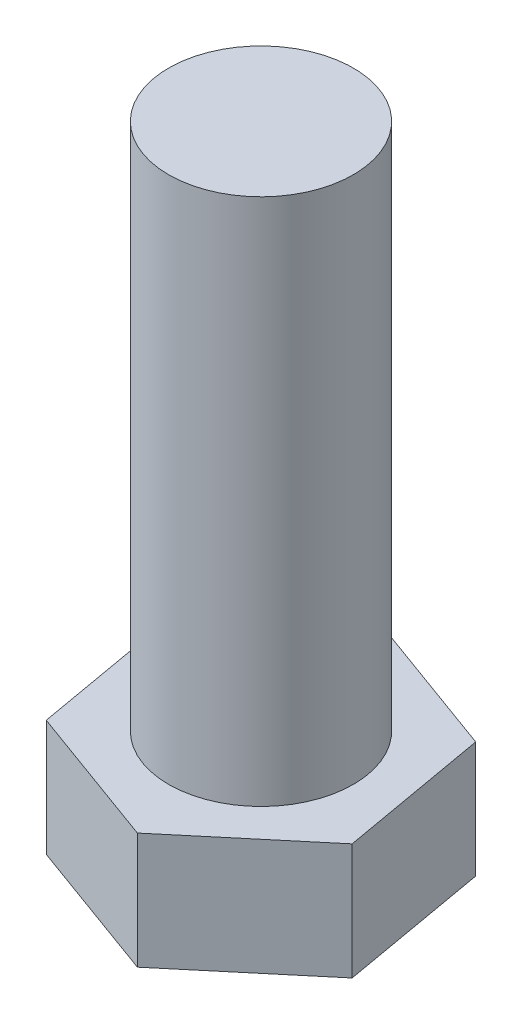
ISO-10303-21;
HEADER;
FILE_DESCRIPTION(('STEP AP214'),'2;1');
FILE_NAME('part.step','',(''),(''),'','','');
FILE_SCHEMA(('AUTOMOTIVE_DESIGN { 1 0 10303 214 1 1 1 1 }'));
ENDSEC;
DATA;
#1=APPLICATION_CONTEXT('core data for automotive mechanical design processes');
#2=APPLICATION_PROTOCOL_DEFINITION('international standard','automotive_design',2000,#1);
#3=PRODUCT_CONTEXT('',#1,'mechanical');
#4=PRODUCT('Part','Part','',(#3));
#5=PRODUCT_RELATED_PRODUCT_CATEGORY('part','',(#4));
#6=PRODUCT_DEFINITION_FORMATION('','',#4);
#7=PRODUCT_DEFINITION_CONTEXT('part definition',#1,'design');
#8=PRODUCT_DEFINITION('design','',#6,#7);
#9=PRODUCT_DEFINITION_SHAPE('','',#8);
#10=(LENGTH_UNIT() NAMED_UNIT(*) SI_UNIT(.MILLI.,.METRE.));
#11=(NAMED_UNIT(*) PLANE_ANGLE_UNIT() SI_UNIT($,.RADIAN.));
#12=(NAMED_UNIT(*) SI_UNIT($,.STERADIAN.) SOLID_ANGLE_UNIT());
#13=UNCERTAINTY_MEASURE_WITH_UNIT(LENGTH_MEASURE(1.E-05),#10,'distance_accuracy_value','');
#14=(GEOMETRIC_REPRESENTATION_CONTEXT(3) GLOBAL_UNCERTAINTY_ASSIGNED_CONTEXT((#13)) GLOBAL_UNIT_ASSIGNED_CONTEXT((#10,
#11,#12)) REPRESENTATION_CONTEXT('',''));
#15=CARTESIAN_POINT('',(0.,0.,0.));
#16=DIRECTION('',(0.,0.,1.));
#17=DIRECTION('',(1.,0.,0.));
#18=AXIS2_PLACEMENT_3D('',#15,#16,#17);
#19=CARTESIAN_POINT('',(2.00670018627211,8.8,11.3713010555411));
#20=DIRECTION('',(0.,1.,0.));
#21=DIRECTION('',(0.,0.,1.));
#22=AXIS2_PLACEMENT_3D('',#19,#20,#21);
#23=PLANE('',#22);
#24=DIRECTION('',(0.939740246120108,0.,0.34188926543856));
#25=VECTOR('',#24,1.);
#26=CARTESIAN_POINT('',(-8.84448549504337,8.8,7.42350386686119));
#27=LINE('',#26,#25);
#28=CARTESIAN_POINT('',(-8.84448549504337,8.8,7.42350386686119));
#29=VERTEX_POINT('',#28);
#30=CARTESIAN_POINT('',(2.00670018627211,8.8,11.3713010555411));
#31=VERTEX_POINT('',#30);
#32=EDGE_CURVE('E128',#29,#31,#27,.T.);
#33=ORIENTED_EDGE('',*,*,#32,.T.);
#34=DIRECTION('',(0.765954912211048,0.,-0.642894293379375));
#35=VECTOR('',#34,1.);
#36=CARTESIAN_POINT('',(2.00670018627211,8.8,11.3713010555411));
#37=LINE('',#36,#35);
#38=CARTESIAN_POINT('',(10.8511856813155,8.8,3.94779718867995));
#39=VERTEX_POINT('',#38);
#40=EDGE_CURVE('E86',#31,#39,#37,.T.);
#41=ORIENTED_EDGE('',*,*,#40,.T.);
#42=DIRECTION('',(-0.17378533390906,0.,-0.984783558817934));
#43=VECTOR('',#42,1.);
#44=CARTESIAN_POINT('',(10.8511856813155,8.8,3.94779718867995));
#45=LINE('',#44,#43);
#46=CARTESIAN_POINT('',(8.84448549504337,8.8,-7.42350386686119));
#47=VERTEX_POINT('',#46);
#48=EDGE_CURVE('E99',#39,#47,#45,.T.);
#49=ORIENTED_EDGE('',*,*,#48,.T.);
#50=DIRECTION('',(-0.939740246120109,0.,-0.34188926543856));
#51=VECTOR('',#50,1.);
#52=CARTESIAN_POINT('',(8.84448549504337,8.8,-7.42350386686119));
#53=LINE('',#52,#51);
#54=CARTESIAN_POINT('',(-2.00670018627212,8.8,-11.3713010555411));
#55=VERTEX_POINT('',#54);
#56=EDGE_CURVE('E93',#47,#55,#53,.T.);
#57=ORIENTED_EDGE('',*,*,#56,.T.);
#58=DIRECTION('',(-0.765954912211048,0.,0.642894293379375));
#59=VECTOR('',#58,1.);
#60=CARTESIAN_POINT('',(-2.00670018627212,8.8,-11.3713010555411));
#61=LINE('',#60,#59);
#62=CARTESIAN_POINT('',(-10.8511856813155,8.8,-3.94779718867995));
#63=VERTEX_POINT('',#62);
#64=EDGE_CURVE('E97',#55,#63,#61,.T.);
#65=ORIENTED_EDGE('',*,*,#64,.T.);
#66=DIRECTION('',(0.17378533390906,0.,0.984783558817934));
#67=VECTOR('',#66,1.);
#68=CARTESIAN_POINT('',(-10.8511856813155,8.8,-3.94779718867995));
#69=LINE('',#68,#67);
#70=EDGE_CURVE('E49',#63,#29,#69,.T.);
#71=ORIENTED_EDGE('',*,*,#70,.T.);
#72=EDGE_LOOP('',(#33,#41,#49,#57,#65,#71));
#73=FACE_BOUND('',#72,.T.);
#74=CARTESIAN_POINT('',(0.,8.8,0.));
#75=DIRECTION('',(0.,1.,0.));
#76=DIRECTION('',(0.,0.,1.));
#77=AXIS2_PLACEMENT_3D('',#74,#75,#76);
#78=CIRCLE('',#77,7.);
#79=CARTESIAN_POINT('',(0.,8.8,7.));
#80=VERTEX_POINT('',#79);
#81=EDGE_CURVE('E168',#80,#80,#78,.T.);
#82=ORIENTED_EDGE('',*,*,#81,.F.);
#83=EDGE_LOOP('',(#82));
#84=FACE_BOUND('',#83,.T.);
#85=ADVANCED_FACE('F32',(#73,#84),#23,.T.);
#86=CARTESIAN_POINT('',(-8.84448549504337,8.8,7.42350386686119));
#87=DIRECTION('',(0.34188926543856,0.,-0.939740246120108));
#88=DIRECTION('',(-0.939740246120109,0.,-0.34188926543856));
#89=AXIS2_PLACEMENT_3D('',#86,#87,#88);
#90=PLANE('',#89);
#91=DIRECTION('',(0.939740246120108,0.,0.34188926543856));
#92=VECTOR('',#91,1.);
#93=CARTESIAN_POINT('',(-8.84448549504337,0.,7.42350386686119));
#94=LINE('',#93,#92);
#95=CARTESIAN_POINT('',(-8.84448549504337,0.,7.42350386686119));
#96=VERTEX_POINT('',#95);
#97=CARTESIAN_POINT('',(2.00670018627211,0.,11.3713010555411));
#98=VERTEX_POINT('',#97);
#99=EDGE_CURVE('E117',#96,#98,#94,.T.);
#100=ORIENTED_EDGE('',*,*,#99,.T.);
#101=DIRECTION('',(0.,-1.,0.));
#102=VECTOR('',#101,1.);
#103=CARTESIAN_POINT('',(2.00670018627211,8.8,11.3713010555411));
#104=LINE('',#103,#102);
#105=EDGE_CURVE('E11',#31,#98,#104,.T.);
#106=ORIENTED_EDGE('',*,*,#105,.F.);
#107=ORIENTED_EDGE('',*,*,#32,.F.);
#108=DIRECTION('',(0.,-1.,0.));
#109=VECTOR('',#108,1.);
#110=CARTESIAN_POINT('',(-8.84448549504337,8.8,7.42350386686119));
#111=LINE('',#110,#109);
#112=EDGE_CURVE('E113',#29,#96,#111,.T.);
#113=ORIENTED_EDGE('',*,*,#112,.T.);
#114=EDGE_LOOP('',(#100,#106,#107,#113));
#115=FACE_BOUND('',#114,.T.);
#116=ADVANCED_FACE('F34',(#115),#90,.F.);
#117=CARTESIAN_POINT('',(2.00670018627211,8.8,11.3713010555411));
#118=DIRECTION('',(-0.642894293379375,0.,-0.765954912211048));
#119=DIRECTION('',(-0.765954912211048,0.,0.642894293379375));
#120=AXIS2_PLACEMENT_3D('',#117,#118,#119);
#121=PLANE('',#120);
#122=DIRECTION('',(0.765954912211048,0.,-0.642894293379375));
#123=VECTOR('',#122,1.);
#124=CARTESIAN_POINT('',(2.00670018627211,0.,11.3713010555411));
#125=LINE('',#124,#123);
#126=CARTESIAN_POINT('',(10.8511856813155,0.,3.94779718867995));
#127=VERTEX_POINT('',#126);
#128=EDGE_CURVE('E120',#98,#127,#125,.T.);
#129=ORIENTED_EDGE('',*,*,#128,.T.);
#130=DIRECTION('',(0.,-1.,0.));
#131=VECTOR('',#130,1.);
#132=CARTESIAN_POINT('',(10.8511856813155,8.8,3.94779718867995));
#133=LINE('',#132,#131);
#134=EDGE_CURVE('E41',#39,#127,#133,.T.);
#135=ORIENTED_EDGE('',*,*,#134,.F.);
#136=ORIENTED_EDGE('',*,*,#40,.F.);
#137=ORIENTED_EDGE('',*,*,#105,.T.);
#138=EDGE_LOOP('',(#129,#135,#136,#137));
#139=FACE_BOUND('',#138,.T.);
#140=ADVANCED_FACE('F156',(#139),#121,.F.);
#141=CARTESIAN_POINT('',(10.8511856813155,8.8,3.94779718867995));
#142=DIRECTION('',(-0.984783558817935,0.,0.17378533390906));
#143=DIRECTION('',(0.17378533390906,0.,0.984783558817935));
#144=AXIS2_PLACEMENT_3D('',#141,#142,#143);
#145=PLANE('',#144);
#146=DIRECTION('',(-0.17378533390906,0.,-0.984783558817934));
#147=VECTOR('',#146,1.);
#148=CARTESIAN_POINT('',(10.8511856813155,0.,3.94779718867995));
#149=LINE('',#148,#147);
#150=CARTESIAN_POINT('',(8.84448549504337,0.,-7.42350386686119));
#151=VERTEX_POINT('',#150);
#152=EDGE_CURVE('E123',#127,#151,#149,.T.);
#153=ORIENTED_EDGE('',*,*,#152,.T.);
#154=DIRECTION('',(0.,-1.,0.));
#155=VECTOR('',#154,1.);
#156=CARTESIAN_POINT('',(8.84448549504337,8.8,-7.42350386686119));
#157=LINE('',#156,#155);
#158=EDGE_CURVE('E108',#47,#151,#157,.T.);
#159=ORIENTED_EDGE('',*,*,#158,.F.);
#160=ORIENTED_EDGE('',*,*,#48,.F.);
#161=ORIENTED_EDGE('',*,*,#134,.T.);
#162=EDGE_LOOP('',(#153,#159,#160,#161));
#163=FACE_BOUND('',#162,.T.);
#164=ADVANCED_FACE('F134',(#163),#145,.F.);
#165=CARTESIAN_POINT('',(8.84448549504337,8.8,-7.42350386686119));
#166=DIRECTION('',(-0.34188926543856,0.,0.939740246120109));
#167=DIRECTION('',(0.939740246120109,0.,0.34188926543856));
#168=AXIS2_PLACEMENT_3D('',#165,#166,#167);
#169=PLANE('',#168);
#170=DIRECTION('',(-0.939740246120109,0.,-0.34188926543856));
#171=VECTOR('',#170,1.);
#172=CARTESIAN_POINT('',(8.84448549504337,0.,-7.42350386686119));
#173=LINE('',#172,#171);
#174=CARTESIAN_POINT('',(-2.00670018627212,0.,-11.3713010555411));
#175=VERTEX_POINT('',#174);
#176=EDGE_CURVE('E107',#151,#175,#173,.T.);
#177=ORIENTED_EDGE('',*,*,#176,.T.);
#178=DIRECTION('',(0.,-1.,0.));
#179=VECTOR('',#178,1.);
#180=CARTESIAN_POINT('',(-2.00670018627212,8.8,-11.3713010555411));
#181=LINE('',#180,#179);
#182=EDGE_CURVE('E104',#55,#175,#181,.T.);
#183=ORIENTED_EDGE('',*,*,#182,.F.);
#184=ORIENTED_EDGE('',*,*,#56,.F.);
#185=ORIENTED_EDGE('',*,*,#158,.T.);
#186=EDGE_LOOP('',(#177,#183,#184,#185));
#187=FACE_BOUND('',#186,.T.);
#188=ADVANCED_FACE('F105',(#187),#169,.F.);
#189=CARTESIAN_POINT('',(-2.00670018627212,8.8,-11.3713010555411));
#190=DIRECTION('',(0.642894293379375,0.,0.765954912211048));
#191=DIRECTION('',(0.765954912211048,0.,-0.642894293379375));
#192=AXIS2_PLACEMENT_3D('',#189,#190,#191);
#193=PLANE('',#192);
#194=DIRECTION('',(-0.765954912211048,0.,0.642894293379375));
#195=VECTOR('',#194,1.);
#196=CARTESIAN_POINT('',(-2.00670018627212,0.,-11.3713010555411));
#197=LINE('',#196,#195);
#198=CARTESIAN_POINT('',(-10.8511856813155,0.,-3.94779718867995));
#199=VERTEX_POINT('',#198);
#200=EDGE_CURVE('E72',#175,#199,#197,.T.);
#201=ORIENTED_EDGE('',*,*,#200,.T.);
#202=DIRECTION('',(0.,-1.,0.));
#203=VECTOR('',#202,1.);
#204=CARTESIAN_POINT('',(-10.8511856813155,8.8,-3.94779718867995));
#205=LINE('',#204,#203);
#206=EDGE_CURVE('E109',#63,#199,#205,.T.);
#207=ORIENTED_EDGE('',*,*,#206,.F.);
#208=ORIENTED_EDGE('',*,*,#64,.F.);
#209=ORIENTED_EDGE('',*,*,#182,.T.);
#210=EDGE_LOOP('',(#201,#207,#208,#209));
#211=FACE_BOUND('',#210,.T.);
#212=ADVANCED_FACE('F111',(#211),#193,.F.);
#213=CARTESIAN_POINT('',(-10.8511856813155,8.8,-3.94779718867995));
#214=DIRECTION('',(0.984783558817935,0.,-0.173785333909061));
#215=DIRECTION('',(-0.173785333909061,0.,-0.984783558817935));
#216=AXIS2_PLACEMENT_3D('',#213,#214,#215);
#217=PLANE('',#216);
#218=DIRECTION('',(0.17378533390906,0.,0.984783558817934));
#219=VECTOR('',#218,1.);
#220=CARTESIAN_POINT('',(-10.8511856813155,0.,-3.94779718867995));
#221=LINE('',#220,#219);
#222=EDGE_CURVE('E78',#199,#96,#221,.T.);
#223=ORIENTED_EDGE('',*,*,#222,.T.);
#224=ORIENTED_EDGE('',*,*,#112,.F.);
#225=ORIENTED_EDGE('',*,*,#70,.F.);
#226=ORIENTED_EDGE('',*,*,#206,.T.);
#227=EDGE_LOOP('',(#223,#224,#225,#226));
#228=FACE_BOUND('',#227,.T.);
#229=ADVANCED_FACE('F141',(#228),#217,.F.);
#230=CARTESIAN_POINT('',(2.00670018627211,0.,11.3713010555411));
#231=DIRECTION('',(0.,1.,0.));
#232=DIRECTION('',(0.,0.,1.));
#233=AXIS2_PLACEMENT_3D('',#230,#231,#232);
#234=PLANE('',#233);
#235=ORIENTED_EDGE('',*,*,#99,.F.);
#236=ORIENTED_EDGE('',*,*,#222,.F.);
#237=ORIENTED_EDGE('',*,*,#200,.F.);
#238=ORIENTED_EDGE('',*,*,#176,.F.);
#239=ORIENTED_EDGE('',*,*,#152,.F.);
#240=ORIENTED_EDGE('',*,*,#128,.F.);
#241=EDGE_LOOP('',(#235,#236,#237,#238,#239,#240));
#242=FACE_BOUND('',#241,.T.);
#243=ADVANCED_FACE('F137',(#242),#234,.F.);
#244=CARTESIAN_POINT('',(0.,48.8,0.));
#245=DIRECTION('',(0.,-1.,0.));
#246=DIRECTION('',(0.,0.,-1.));
#247=AXIS2_PLACEMENT_3D('',#244,#245,#246);
#248=CYLINDRICAL_SURFACE('',#247,7.);
#249=CARTESIAN_POINT('',(0.,48.8,0.));
#250=DIRECTION('',(0.,1.,0.));
#251=DIRECTION('',(0.,0.,1.));
#252=AXIS2_PLACEMENT_3D('',#249,#250,#251);
#253=CIRCLE('',#252,7.);
#254=CARTESIAN_POINT('',(0.,48.8,7.));
#255=VERTEX_POINT('',#254);
#256=EDGE_CURVE('E121',#255,#255,#253,.T.);
#257=ORIENTED_EDGE('',*,*,#256,.F.);
#258=EDGE_LOOP('',(#257));
#259=FACE_BOUND('',#258,.T.);
#260=ORIENTED_EDGE('',*,*,#81,.T.);
#261=EDGE_LOOP('',(#260));
#262=FACE_BOUND('',#261,.T.);
#263=ADVANCED_FACE('F148',(#259,#262),#248,.T.);
#264=CARTESIAN_POINT('',(0.,48.8,0.));
#265=DIRECTION('',(0.,1.,0.));
#266=DIRECTION('',(0.,0.,1.));
#267=AXIS2_PLACEMENT_3D('',#264,#265,#266);
#268=PLANE('',#267);
#269=ORIENTED_EDGE('',*,*,#256,.T.);
#270=EDGE_LOOP('',(#269));
#271=FACE_BOUND('',#270,.T.);
#272=ADVANCED_FACE('F160',(#271),#268,.T.);
#273=CLOSED_SHELL('',(#85,#116,#140,#164,#188,#212,#229,#243,#263,#272));
#274=MANIFOLD_SOLID_BREP('B2',#273);
#275=ADVANCED_BREP_SHAPE_REPRESENTATION('',(#18,#274),#14);
#276=SHAPE_DEFINITION_REPRESENTATION(#9,#275);
ENDSEC;
END-ISO-10303-21;
